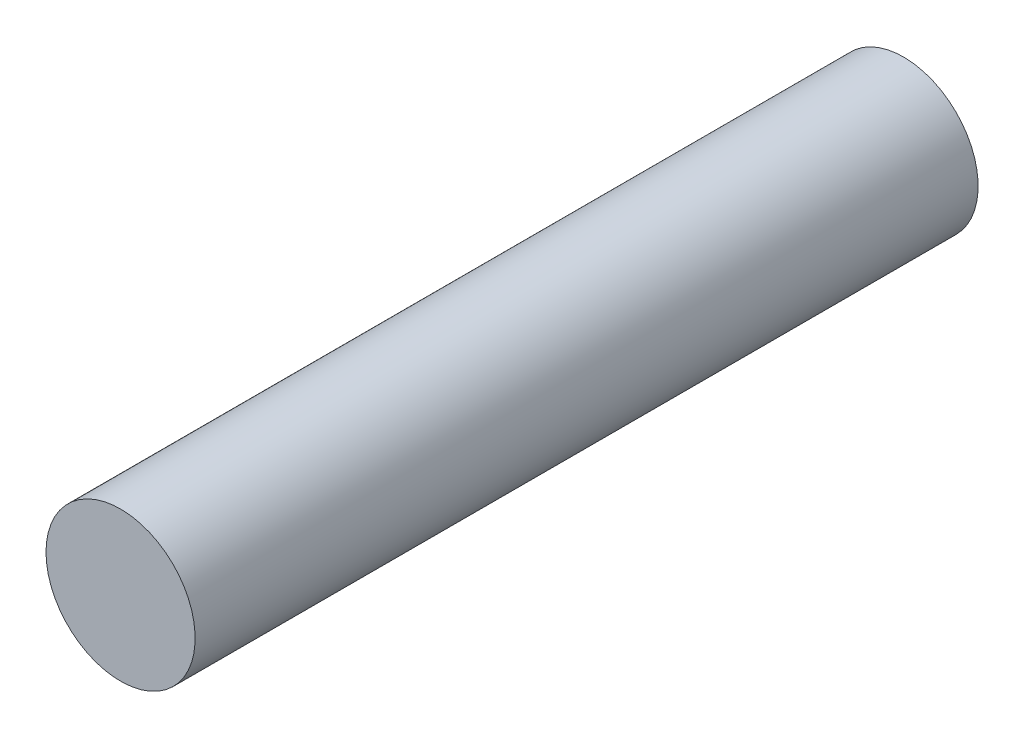
ISO-10303-21;
HEADER;
FILE_DESCRIPTION(('STEP AP214'),'2;1');
FILE_NAME('part.step','',(''),(''),'','','');
FILE_SCHEMA(('AUTOMOTIVE_DESIGN { 1 0 10303 214 1 1 1 1 }'));
ENDSEC;
DATA;
#1=APPLICATION_CONTEXT('core data for automotive mechanical design processes');
#2=APPLICATION_PROTOCOL_DEFINITION('international standard','automotive_design',2000,#1);
#3=PRODUCT_CONTEXT('',#1,'mechanical');
#4=PRODUCT('Part','Part','',(#3));
#5=PRODUCT_RELATED_PRODUCT_CATEGORY('part','',(#4));
#6=PRODUCT_DEFINITION_FORMATION('','',#4);
#7=PRODUCT_DEFINITION_CONTEXT('part definition',#1,'design');
#8=PRODUCT_DEFINITION('design','',#6,#7);
#9=PRODUCT_DEFINITION_SHAPE('','',#8);
#10=(LENGTH_UNIT() NAMED_UNIT(*) SI_UNIT(.MILLI.,.METRE.));
#11=(NAMED_UNIT(*) PLANE_ANGLE_UNIT() SI_UNIT($,.RADIAN.));
#12=(NAMED_UNIT(*) SI_UNIT($,.STERADIAN.) SOLID_ANGLE_UNIT());
#13=UNCERTAINTY_MEASURE_WITH_UNIT(LENGTH_MEASURE(1.E-05),#10,'distance_accuracy_value','');
#14=(GEOMETRIC_REPRESENTATION_CONTEXT(3) GLOBAL_UNCERTAINTY_ASSIGNED_CONTEXT((#13)) GLOBAL_UNIT_ASSIGNED_CONTEXT((#10,
#11,#12)) REPRESENTATION_CONTEXT('',''));
#15=CARTESIAN_POINT('',(0.,0.,0.));
#16=DIRECTION('',(0.,0.,1.));
#17=DIRECTION('',(1.,0.,0.));
#18=AXIS2_PLACEMENT_3D('',#15,#16,#17);
#19=CARTESIAN_POINT('',(0.,0.,21.));
#20=DIRECTION('',(0.,0.,-1.));
#21=DIRECTION('',(-1.,0.,0.));
#22=AXIS2_PLACEMENT_3D('',#19,#20,#21);
#23=CYLINDRICAL_SURFACE('',#22,4.);
#24=CARTESIAN_POINT('',(0.,0.,21.));
#25=DIRECTION('',(0.,0.,1.));
#26=DIRECTION('',(1.,0.,0.));
#27=AXIS2_PLACEMENT_3D('',#24,#25,#26);
#28=CIRCLE('',#27,4.);
#29=CARTESIAN_POINT('',(-4.,0.,21.));
#30=VERTEX_POINT('',#29);
#31=EDGE_CURVE('E10',#30,#30,#28,.T.);
#32=CARTESIAN_POINT('',(0.,0.,-21.));
#33=DIRECTION('',(0.,0.,1.));
#34=DIRECTION('',(1.,0.,0.));
#35=AXIS2_PLACEMENT_3D('',#32,#33,#34);
#36=CIRCLE('',#35,4.);
#37=CARTESIAN_POINT('',(-4.,0.,-21.));
#38=VERTEX_POINT('',#37);
#39=EDGE_CURVE('E35',#38,#38,#36,.T.);
#40=CARTESIAN_POINT('',(-4.,0.,21.));
#41=CARTESIAN_POINT('',(-4.,0.,20.5625));
#42=CARTESIAN_POINT('',(-4.,0.,20.125));
#43=CARTESIAN_POINT('',(-4.,0.,19.25));
#44=CARTESIAN_POINT('',(-4.,0.,18.8125));
#45=CARTESIAN_POINT('',(-4.,0.,17.9375));
#46=CARTESIAN_POINT('',(-4.,0.,17.5));
#47=CARTESIAN_POINT('',(-4.,0.,16.625));
#48=CARTESIAN_POINT('',(-4.,0.,16.1875));
#49=CARTESIAN_POINT('',(-4.,0.,15.3125));
#50=CARTESIAN_POINT('',(-4.,0.,14.875));
#51=CARTESIAN_POINT('',(-4.,0.,14.));
#52=CARTESIAN_POINT('',(-4.,0.,13.5625));
#53=CARTESIAN_POINT('',(-4.,0.,12.6875));
#54=CARTESIAN_POINT('',(-4.,0.,12.25));
#55=CARTESIAN_POINT('',(-4.,0.,11.375));
#56=CARTESIAN_POINT('',(-4.,0.,10.9375));
#57=CARTESIAN_POINT('',(-4.,0.,10.0625));
#58=CARTESIAN_POINT('',(-4.,0.,9.625));
#59=CARTESIAN_POINT('',(-4.,0.,8.75));
#60=CARTESIAN_POINT('',(-4.,0.,8.3125));
#61=CARTESIAN_POINT('',(-4.,0.,7.4375));
#62=CARTESIAN_POINT('',(-4.,0.,7.));
#63=CARTESIAN_POINT('',(-4.,0.,6.125));
#64=CARTESIAN_POINT('',(-4.,0.,5.6875));
#65=CARTESIAN_POINT('',(-4.,0.,4.8125));
#66=CARTESIAN_POINT('',(-4.,0.,4.375));
#67=CARTESIAN_POINT('',(-4.,0.,3.5));
#68=CARTESIAN_POINT('',(-4.,0.,3.0625));
#69=CARTESIAN_POINT('',(-4.,0.,2.1875));
#70=CARTESIAN_POINT('',(-4.,0.,1.75));
#71=CARTESIAN_POINT('',(-4.,0.,0.875000000000001));
#72=CARTESIAN_POINT('',(-4.,0.,0.4375));
#73=CARTESIAN_POINT('',(-4.,0.,-0.4375));
#74=CARTESIAN_POINT('',(-4.,0.,-0.875000000000001));
#75=CARTESIAN_POINT('',(-4.,0.,-1.75));
#76=CARTESIAN_POINT('',(-4.,0.,-2.1875));
#77=CARTESIAN_POINT('',(-4.,0.,-3.0625));
#78=CARTESIAN_POINT('',(-4.,0.,-3.5));
#79=CARTESIAN_POINT('',(-4.,0.,-4.375));
#80=CARTESIAN_POINT('',(-4.,0.,-4.8125));
#81=CARTESIAN_POINT('',(-4.,0.,-5.6875));
#82=CARTESIAN_POINT('',(-4.,0.,-6.125));
#83=CARTESIAN_POINT('',(-4.,0.,-7.));
#84=CARTESIAN_POINT('',(-4.,0.,-7.4375));
#85=CARTESIAN_POINT('',(-4.,0.,-8.3125));
#86=CARTESIAN_POINT('',(-4.,0.,-8.75));
#87=CARTESIAN_POINT('',(-4.,0.,-9.625));
#88=CARTESIAN_POINT('',(-4.,0.,-10.0625));
#89=CARTESIAN_POINT('',(-4.,0.,-10.9375));
#90=CARTESIAN_POINT('',(-4.,0.,-11.375));
#91=CARTESIAN_POINT('',(-4.,0.,-12.25));
#92=CARTESIAN_POINT('',(-4.,0.,-12.6875));
#93=CARTESIAN_POINT('',(-4.,0.,-13.5625));
#94=CARTESIAN_POINT('',(-4.,0.,-14.));
#95=CARTESIAN_POINT('',(-4.,0.,-14.875));
#96=CARTESIAN_POINT('',(-4.,0.,-15.3125));
#97=CARTESIAN_POINT('',(-4.,0.,-16.1875));
#98=CARTESIAN_POINT('',(-4.,0.,-16.625));
#99=CARTESIAN_POINT('',(-4.,0.,-17.5));
#100=CARTESIAN_POINT('',(-4.,0.,-17.9375));
#101=CARTESIAN_POINT('',(-4.,0.,-18.8125));
#102=CARTESIAN_POINT('',(-4.,0.,-19.25));
#103=CARTESIAN_POINT('',(-4.,0.,-20.125));
#104=CARTESIAN_POINT('',(-4.,0.,-20.5625));
#105=CARTESIAN_POINT('',(-4.,0.,-21.));
#106=B_SPLINE_CURVE_WITH_KNOTS('',3,(#40,#41,#42,#43,#44,#45,#46,#47,#48,#49,#50,#51,#52,#53,
#54,#55,#56,#57,#58,#59,#60,#61,#62,#63,#64,#65,#66,#67,#68,#69,#70,#71,#72,#73,#74,#75,#76,#77,
#78,#79,#80,#81,#82,#83,#84,#85,#86,#87,#88,#89,#90,#91,#92,#93,#94,#95,#96,#97,#98,#99,#100,
#101,#102,#103,#104,#105),.UNSPECIFIED.,.F.,.F.,(4,2,2,2,2,2,2,2,2,2,2,2,2,2,2,2,2,2,2,2,2,2,2,
2,2,2,2,2,2,2,2,2,4),(0.,1.3125,2.625,3.9375,5.25,6.5625,7.875,9.1875,10.5,11.8125,13.125,
14.4375,15.75,17.0625,18.375,19.6875,21.,22.3125,23.625,24.9375,26.25,27.5625,28.875,30.1875,
31.5,32.8125,34.125,35.4375,36.75,38.0625,39.375,40.6875,42.),.UNSPECIFIED.);
#107=EDGE_CURVE('BSEAM32',#30,#38,#106,.T.);
#108=ORIENTED_EDGE('',*,*,#31,.F.);
#109=ORIENTED_EDGE('',*,*,#39,.T.);
#110=ORIENTED_EDGE('',*,*,#107,.T.);
#111=ORIENTED_EDGE('',*,*,#107,.F.);
#112=EDGE_LOOP('',(#108,#110,#109,#111));
#113=FACE_BOUND('',#112,.T.);
#114=ADVANCED_FACE('F32',(#113),#23,.T.);
#115=CARTESIAN_POINT('',(0.,0.,21.));
#116=DIRECTION('',(0.,0.,1.));
#117=DIRECTION('',(1.,0.,0.));
#118=AXIS2_PLACEMENT_3D('',#115,#116,#117);
#119=PLANE('',#118);
#120=ORIENTED_EDGE('',*,*,#31,.T.);
#121=EDGE_LOOP('',(#120));
#122=FACE_BOUND('',#121,.T.);
#123=ADVANCED_FACE('F47',(#122),#119,.T.);
#124=CARTESIAN_POINT('',(0.,0.,-21.));
#125=DIRECTION('',(0.,0.,1.));
#126=DIRECTION('',(1.,0.,0.));
#127=AXIS2_PLACEMENT_3D('',#124,#125,#126);
#128=PLANE('',#127);
#129=ORIENTED_EDGE('',*,*,#39,.F.);
#130=EDGE_LOOP('',(#129));
#131=FACE_BOUND('',#130,.T.);
#132=ADVANCED_FACE('F45',(#131),#128,.F.);
#133=CLOSED_SHELL('',(#114,#123,#132));
#134=MANIFOLD_SOLID_BREP('B2',#133);
#135=ADVANCED_BREP_SHAPE_REPRESENTATION('',(#18,#134),#14);
#136=SHAPE_DEFINITION_REPRESENTATION(#9,#135);
ENDSEC;
END-ISO-10303-21;
